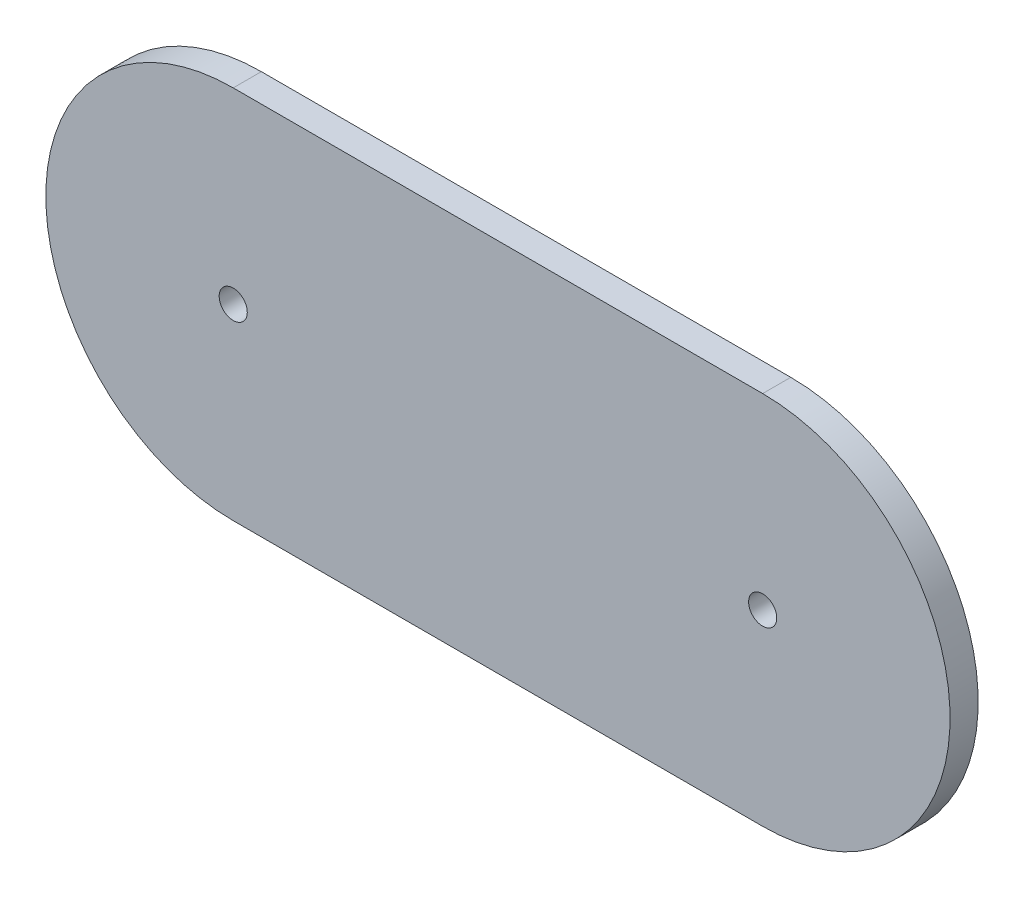
ISO-10303-21;
HEADER;
FILE_DESCRIPTION(('STEP AP214'),'2;1');
FILE_NAME('part.step','',(''),(''),'','','');
FILE_SCHEMA(('AUTOMOTIVE_DESIGN { 1 0 10303 214 1 1 1 1 }'));
ENDSEC;
DATA;
#1=APPLICATION_CONTEXT('core data for automotive mechanical design processes');
#2=APPLICATION_PROTOCOL_DEFINITION('international standard','automotive_design',2000,#1);
#3=PRODUCT_CONTEXT('',#1,'mechanical');
#4=PRODUCT('Part','Part','',(#3));
#5=PRODUCT_RELATED_PRODUCT_CATEGORY('part','',(#4));
#6=PRODUCT_DEFINITION_FORMATION('','',#4);
#7=PRODUCT_DEFINITION_CONTEXT('part definition',#1,'design');
#8=PRODUCT_DEFINITION('design','',#6,#7);
#9=PRODUCT_DEFINITION_SHAPE('','',#8);
#10=(LENGTH_UNIT() NAMED_UNIT(*) SI_UNIT(.MILLI.,.METRE.));
#11=(NAMED_UNIT(*) PLANE_ANGLE_UNIT() SI_UNIT($,.RADIAN.));
#12=(NAMED_UNIT(*) SI_UNIT($,.STERADIAN.) SOLID_ANGLE_UNIT());
#13=UNCERTAINTY_MEASURE_WITH_UNIT(LENGTH_MEASURE(1.E-05),#10,'distance_accuracy_value','');
#14=(GEOMETRIC_REPRESENTATION_CONTEXT(3) GLOBAL_UNCERTAINTY_ASSIGNED_CONTEXT((#13)) GLOBAL_UNIT_ASSIGNED_CONTEXT((#10,
#11,#12)) REPRESENTATION_CONTEXT('',''));
#15=CARTESIAN_POINT('',(0.,0.,0.));
#16=DIRECTION('',(0.,0.,1.));
#17=DIRECTION('',(1.,0.,0.));
#18=AXIS2_PLACEMENT_3D('',#15,#16,#17);
#19=CARTESIAN_POINT('',(28.25,0.,3.));
#20=DIRECTION('',(0.,0.,1.));
#21=DIRECTION('',(1.,0.,0.));
#22=AXIS2_PLACEMENT_3D('',#19,#20,#21);
#23=PLANE('',#22);
#24=CARTESIAN_POINT('',(-28.25,0.,3.));
#25=DIRECTION('',(0.,0.,1.));
#26=DIRECTION('',(1.,0.,0.));
#27=AXIS2_PLACEMENT_3D('',#24,#25,#26);
#28=CIRCLE('',#27,1.5);
#29=CARTESIAN_POINT('',(-26.75,0.,3.));
#30=VERTEX_POINT('',#29);
#31=EDGE_CURVE('E100',#30,#30,#28,.T.);
#32=ORIENTED_EDGE('',*,*,#31,.F.);
#33=EDGE_LOOP('',(#32));
#34=FACE_BOUND('',#33,.T.);
#35=CARTESIAN_POINT('',(28.25,0.,3.));
#36=DIRECTION('',(0.,0.,1.));
#37=DIRECTION('',(1.,0.,0.));
#38=AXIS2_PLACEMENT_3D('',#35,#36,#37);
#39=CIRCLE('',#38,20.);
#40=CARTESIAN_POINT('',(28.25,-20.,3.));
#41=VERTEX_POINT('',#40);
#42=CARTESIAN_POINT('',(28.25,20.,3.));
#43=VERTEX_POINT('',#42);
#44=EDGE_CURVE('E85',#41,#43,#39,.T.);
#45=ORIENTED_EDGE('',*,*,#44,.T.);
#46=DIRECTION('',(-1.,0.,0.));
#47=VECTOR('',#46,1.);
#48=CARTESIAN_POINT('',(-28.25,20.,3.));
#49=LINE('',#48,#47);
#50=CARTESIAN_POINT('',(-28.25,20.,3.));
#51=VERTEX_POINT('',#50);
#52=EDGE_CURVE('E80',#43,#51,#49,.T.);
#53=ORIENTED_EDGE('',*,*,#52,.T.);
#54=CARTESIAN_POINT('',(-28.25,0.,3.));
#55=DIRECTION('',(0.,0.,1.));
#56=DIRECTION('',(1.,0.,0.));
#57=AXIS2_PLACEMENT_3D('',#54,#55,#56);
#58=CIRCLE('',#57,20.);
#59=CARTESIAN_POINT('',(-28.25,-20.,3.));
#60=VERTEX_POINT('',#59);
#61=EDGE_CURVE('E83',#51,#60,#58,.T.);
#62=ORIENTED_EDGE('',*,*,#61,.T.);
#63=DIRECTION('',(1.,0.,0.));
#64=VECTOR('',#63,1.);
#65=CARTESIAN_POINT('',(-28.25,-20.,3.));
#66=LINE('',#65,#64);
#67=EDGE_CURVE('E50',#60,#41,#66,.T.);
#68=ORIENTED_EDGE('',*,*,#67,.T.);
#69=EDGE_LOOP('',(#45,#53,#62,#68));
#70=FACE_BOUND('',#69,.T.);
#71=CARTESIAN_POINT('',(28.25,0.,3.));
#72=DIRECTION('',(0.,0.,1.));
#73=DIRECTION('',(1.,0.,0.));
#74=AXIS2_PLACEMENT_3D('',#71,#72,#73);
#75=CIRCLE('',#74,1.5);
#76=CARTESIAN_POINT('',(29.75,0.,3.));
#77=VERTEX_POINT('',#76);
#78=EDGE_CURVE('E115',#77,#77,#75,.T.);
#79=ORIENTED_EDGE('',*,*,#78,.F.);
#80=EDGE_LOOP('',(#79));
#81=FACE_BOUND('',#80,.T.);
#82=ADVANCED_FACE('F33',(#34,#70,#81),#23,.T.);
#83=CARTESIAN_POINT('',(28.25,0.,0.));
#84=DIRECTION('',(0.,0.,1.));
#85=DIRECTION('',(1.,0.,0.));
#86=AXIS2_PLACEMENT_3D('',#83,#84,#85);
#87=PLANE('',#86);
#88=CARTESIAN_POINT('',(-28.25,0.,0.));
#89=DIRECTION('',(0.,0.,1.));
#90=DIRECTION('',(1.,0.,0.));
#91=AXIS2_PLACEMENT_3D('',#88,#89,#90);
#92=CIRCLE('',#91,1.5);
#93=CARTESIAN_POINT('',(-26.75,0.,0.));
#94=VERTEX_POINT('',#93);
#95=EDGE_CURVE('E112',#94,#94,#92,.T.);
#96=ORIENTED_EDGE('',*,*,#95,.T.);
#97=EDGE_LOOP('',(#96));
#98=FACE_BOUND('',#97,.T.);
#99=CARTESIAN_POINT('',(28.25,0.,0.));
#100=DIRECTION('',(0.,0.,1.));
#101=DIRECTION('',(1.,0.,0.));
#102=AXIS2_PLACEMENT_3D('',#99,#100,#101);
#103=CIRCLE('',#102,20.);
#104=CARTESIAN_POINT('',(28.25,-20.,0.));
#105=VERTEX_POINT('',#104);
#106=CARTESIAN_POINT('',(28.25,20.,0.));
#107=VERTEX_POINT('',#106);
#108=EDGE_CURVE('E97',#105,#107,#103,.T.);
#109=ORIENTED_EDGE('',*,*,#108,.F.);
#110=DIRECTION('',(1.,0.,0.));
#111=VECTOR('',#110,1.);
#112=CARTESIAN_POINT('',(-28.25,-20.,0.));
#113=LINE('',#112,#111);
#114=CARTESIAN_POINT('',(-28.25,-20.,0.));
#115=VERTEX_POINT('',#114);
#116=EDGE_CURVE('E73',#115,#105,#113,.T.);
#117=ORIENTED_EDGE('',*,*,#116,.F.);
#118=CARTESIAN_POINT('',(-28.25,0.,0.));
#119=DIRECTION('',(0.,0.,1.));
#120=DIRECTION('',(1.,0.,0.));
#121=AXIS2_PLACEMENT_3D('',#118,#119,#120);
#122=CIRCLE('',#121,20.);
#123=CARTESIAN_POINT('',(-28.25,20.,0.));
#124=VERTEX_POINT('',#123);
#125=EDGE_CURVE('E67',#124,#115,#122,.T.);
#126=ORIENTED_EDGE('',*,*,#125,.F.);
#127=DIRECTION('',(-1.,0.,0.));
#128=VECTOR('',#127,1.);
#129=CARTESIAN_POINT('',(-28.25,20.,0.));
#130=LINE('',#129,#128);
#131=EDGE_CURVE('E89',#107,#124,#130,.T.);
#132=ORIENTED_EDGE('',*,*,#131,.F.);
#133=EDGE_LOOP('',(#109,#117,#126,#132));
#134=FACE_BOUND('',#133,.T.);
#135=CARTESIAN_POINT('',(28.25,0.,0.));
#136=DIRECTION('',(0.,0.,1.));
#137=DIRECTION('',(1.,0.,0.));
#138=AXIS2_PLACEMENT_3D('',#135,#136,#137);
#139=CIRCLE('',#138,1.5);
#140=CARTESIAN_POINT('',(29.75,0.,0.));
#141=VERTEX_POINT('',#140);
#142=EDGE_CURVE('E118',#141,#141,#139,.T.);
#143=ORIENTED_EDGE('',*,*,#142,.T.);
#144=EDGE_LOOP('',(#143));
#145=FACE_BOUND('',#144,.T.);
#146=ADVANCED_FACE('F108',(#98,#134,#145),#87,.F.);
#147=CARTESIAN_POINT('',(28.25,0.,3.));
#148=DIRECTION('',(0.,0.,-1.));
#149=DIRECTION('',(-1.,0.,0.));
#150=AXIS2_PLACEMENT_3D('',#147,#148,#149);
#151=CYLINDRICAL_SURFACE('',#150,20.);
#152=ORIENTED_EDGE('',*,*,#108,.T.);
#153=DIRECTION('',(0.,0.,-1.));
#154=VECTOR('',#153,1.);
#155=CARTESIAN_POINT('',(28.25,20.,3.));
#156=LINE('',#155,#154);
#157=EDGE_CURVE('E11',#43,#107,#156,.T.);
#158=ORIENTED_EDGE('',*,*,#157,.F.);
#159=ORIENTED_EDGE('',*,*,#44,.F.);
#160=DIRECTION('',(0.,0.,-1.));
#161=VECTOR('',#160,1.);
#162=CARTESIAN_POINT('',(28.25,-20.,3.));
#163=LINE('',#162,#161);
#164=EDGE_CURVE('E93',#41,#105,#163,.T.);
#165=ORIENTED_EDGE('',*,*,#164,.T.);
#166=EDGE_LOOP('',(#152,#158,#159,#165));
#167=FACE_BOUND('',#166,.T.);
#168=ADVANCED_FACE('F35',(#167),#151,.T.);
#169=CARTESIAN_POINT('',(-28.25,20.,3.));
#170=DIRECTION('',(0.,-1.,0.));
#171=DIRECTION('',(0.,0.,-1.));
#172=AXIS2_PLACEMENT_3D('',#169,#170,#171);
#173=PLANE('',#172);
#174=ORIENTED_EDGE('',*,*,#131,.T.);
#175=DIRECTION('',(0.,0.,-1.));
#176=VECTOR('',#175,1.);
#177=CARTESIAN_POINT('',(-28.25,20.,3.));
#178=LINE('',#177,#176);
#179=EDGE_CURVE('E42',#51,#124,#178,.T.);
#180=ORIENTED_EDGE('',*,*,#179,.F.);
#181=ORIENTED_EDGE('',*,*,#52,.F.);
#182=ORIENTED_EDGE('',*,*,#157,.T.);
#183=EDGE_LOOP('',(#174,#180,#181,#182));
#184=FACE_BOUND('',#183,.T.);
#185=ADVANCED_FACE('F88',(#184),#173,.F.);
#186=CARTESIAN_POINT('',(-28.25,0.,3.));
#187=DIRECTION('',(0.,0.,-1.));
#188=DIRECTION('',(-1.,0.,0.));
#189=AXIS2_PLACEMENT_3D('',#186,#187,#188);
#190=CYLINDRICAL_SURFACE('',#189,20.);
#191=ORIENTED_EDGE('',*,*,#125,.T.);
#192=DIRECTION('',(0.,0.,-1.));
#193=VECTOR('',#192,1.);
#194=CARTESIAN_POINT('',(-28.25,-20.,3.));
#195=LINE('',#194,#193);
#196=EDGE_CURVE('E90',#60,#115,#195,.T.);
#197=ORIENTED_EDGE('',*,*,#196,.F.);
#198=ORIENTED_EDGE('',*,*,#61,.F.);
#199=ORIENTED_EDGE('',*,*,#179,.T.);
#200=EDGE_LOOP('',(#191,#197,#198,#199));
#201=FACE_BOUND('',#200,.T.);
#202=ADVANCED_FACE('F91',(#201),#190,.T.);
#203=CARTESIAN_POINT('',(-28.25,-20.,3.));
#204=DIRECTION('',(0.,1.,0.));
#205=DIRECTION('',(0.,0.,1.));
#206=AXIS2_PLACEMENT_3D('',#203,#204,#205);
#207=PLANE('',#206);
#208=ORIENTED_EDGE('',*,*,#116,.T.);
#209=ORIENTED_EDGE('',*,*,#164,.F.);
#210=ORIENTED_EDGE('',*,*,#67,.F.);
#211=ORIENTED_EDGE('',*,*,#196,.T.);
#212=EDGE_LOOP('',(#208,#209,#210,#211));
#213=FACE_BOUND('',#212,.T.);
#214=ADVANCED_FACE('F105',(#213),#207,.F.);
#215=CARTESIAN_POINT('',(-28.25,0.,3.));
#216=DIRECTION('',(0.,0.,-1.));
#217=DIRECTION('',(-1.,0.,0.));
#218=AXIS2_PLACEMENT_3D('',#215,#216,#217);
#219=CYLINDRICAL_SURFACE('',#218,1.5);
#220=ORIENTED_EDGE('',*,*,#31,.T.);
#221=EDGE_LOOP('',(#220));
#222=FACE_BOUND('',#221,.T.);
#223=ORIENTED_EDGE('',*,*,#95,.F.);
#224=EDGE_LOOP('',(#223));
#225=FACE_BOUND('',#224,.T.);
#226=ADVANCED_FACE('F136',(#222,#225),#219,.F.);
#227=CARTESIAN_POINT('',(28.25,0.,3.));
#228=DIRECTION('',(0.,0.,-1.));
#229=DIRECTION('',(-1.,0.,0.));
#230=AXIS2_PLACEMENT_3D('',#227,#228,#229);
#231=CYLINDRICAL_SURFACE('',#230,1.5);
#232=ORIENTED_EDGE('',*,*,#78,.T.);
#233=EDGE_LOOP('',(#232));
#234=FACE_BOUND('',#233,.T.);
#235=ORIENTED_EDGE('',*,*,#142,.F.);
#236=EDGE_LOOP('',(#235));
#237=FACE_BOUND('',#236,.T.);
#238=ADVANCED_FACE('F124',(#234,#237),#231,.F.);
#239=CLOSED_SHELL('',(#82,#146,#168,#185,#202,#214,#226,#238));
#240=MANIFOLD_SOLID_BREP('B2',#239);
#241=ADVANCED_BREP_SHAPE_REPRESENTATION('',(#18,#240),#14);
#242=SHAPE_DEFINITION_REPRESENTATION(#9,#241);
ENDSEC;
END-ISO-10303-21;
